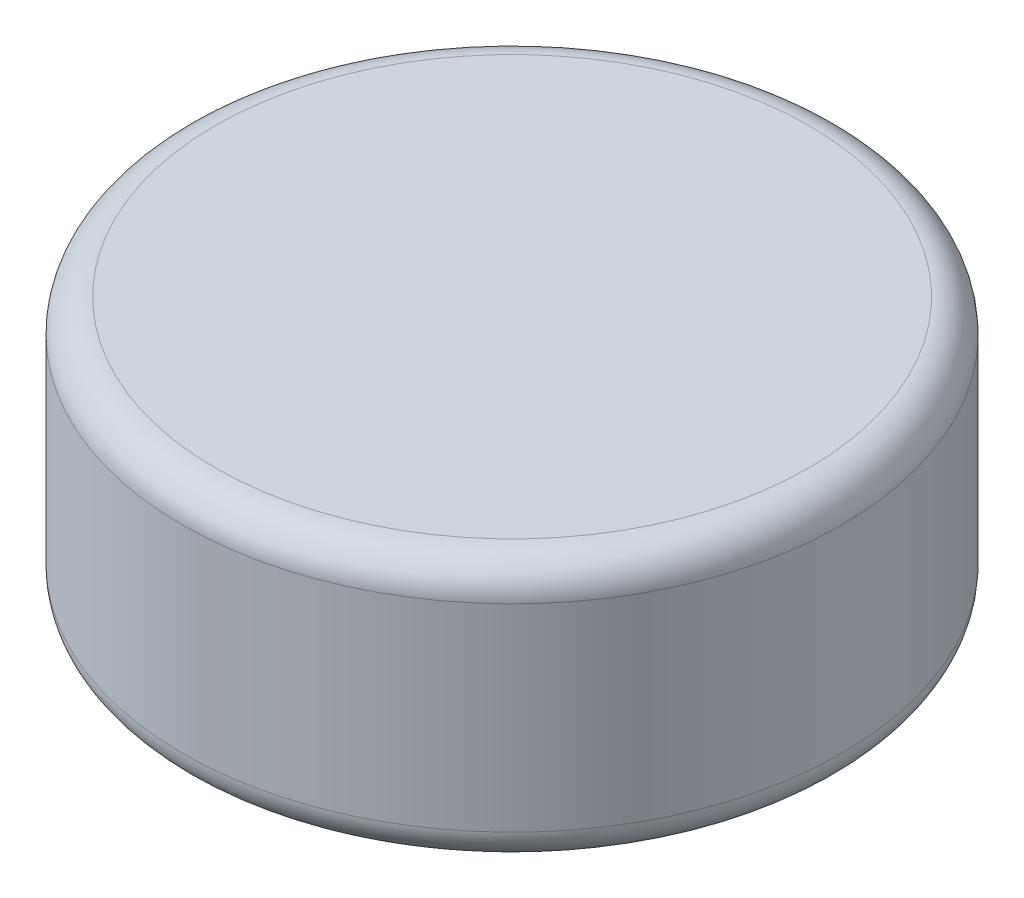
ISO-10303-21;
HEADER;
FILE_DESCRIPTION(('STEP AP214'),'2;1');
FILE_NAME('part.step','',(''),(''),'','','');
FILE_SCHEMA(('AUTOMOTIVE_DESIGN { 1 0 10303 214 1 1 1 1 }'));
ENDSEC;
DATA;
#1=APPLICATION_CONTEXT('core data for automotive mechanical design processes');
#2=APPLICATION_PROTOCOL_DEFINITION('international standard','automotive_design',2000,#1);
#3=PRODUCT_CONTEXT('',#1,'mechanical');
#4=PRODUCT('Part','Part','',(#3));
#5=PRODUCT_RELATED_PRODUCT_CATEGORY('part','',(#4));
#6=PRODUCT_DEFINITION_FORMATION('','',#4);
#7=PRODUCT_DEFINITION_CONTEXT('part definition',#1,'design');
#8=PRODUCT_DEFINITION('design','',#6,#7);
#9=PRODUCT_DEFINITION_SHAPE('','',#8);
#10=(LENGTH_UNIT() NAMED_UNIT(*) SI_UNIT(.MILLI.,.METRE.));
#11=(NAMED_UNIT(*) PLANE_ANGLE_UNIT() SI_UNIT($,.RADIAN.));
#12=(NAMED_UNIT(*) SI_UNIT($,.STERADIAN.) SOLID_ANGLE_UNIT());
#13=UNCERTAINTY_MEASURE_WITH_UNIT(LENGTH_MEASURE(1.E-05),#10,'distance_accuracy_value','');
#14=(GEOMETRIC_REPRESENTATION_CONTEXT(3) GLOBAL_UNCERTAINTY_ASSIGNED_CONTEXT((#13)) GLOBAL_UNIT_ASSIGNED_CONTEXT((#10,
#11,#12)) REPRESENTATION_CONTEXT('',''));
#15=CARTESIAN_POINT('',(0.,0.,0.));
#16=DIRECTION('',(0.,0.,1.));
#17=DIRECTION('',(1.,0.,0.));
#18=AXIS2_PLACEMENT_3D('',#15,#16,#17);
#19=CARTESIAN_POINT('',(0.,2.,0.));
#20=DIRECTION('',(0.,-1.,0.));
#21=DIRECTION('',(0.,0.,-1.));
#22=AXIS2_PLACEMENT_3D('',#19,#20,#21);
#23=CYLINDRICAL_SURFACE('',#22,2.5);
#24=CARTESIAN_POINT('',(0.,0.25,0.));
#25=DIRECTION('',(0.,1.,0.));
#26=DIRECTION('',(0.,0.,1.));
#27=AXIS2_PLACEMENT_3D('',#24,#25,#26);
#28=CIRCLE('',#27,2.5);
#29=CARTESIAN_POINT('',(0.,0.25,2.5));
#30=VERTEX_POINT('',#29);
#31=EDGE_CURVE('E46',#30,#30,#28,.T.);
#32=ORIENTED_EDGE('',*,*,#31,.T.);
#33=EDGE_LOOP('',(#32));
#34=FACE_BOUND('',#33,.T.);
#35=CARTESIAN_POINT('',(0.,1.75,0.));
#36=DIRECTION('',(0.,1.,0.));
#37=DIRECTION('',(0.,0.,1.));
#38=AXIS2_PLACEMENT_3D('',#35,#36,#37);
#39=CIRCLE('',#38,2.5);
#40=CARTESIAN_POINT('',(0.,1.75,2.5));
#41=VERTEX_POINT('',#40);
#42=EDGE_CURVE('E50',#41,#41,#39,.F.);
#43=ORIENTED_EDGE('',*,*,#42,.T.);
#44=EDGE_LOOP('',(#43));
#45=FACE_BOUND('',#44,.T.);
#46=ADVANCED_FACE('F35',(#34,#45),#23,.T.);
#47=CARTESIAN_POINT('',(0.,2.,0.));
#48=DIRECTION('',(0.,1.,0.));
#49=DIRECTION('',(0.,0.,1.));
#50=AXIS2_PLACEMENT_3D('',#47,#48,#49);
#51=PLANE('',#50);
#52=CARTESIAN_POINT('',(0.,2.,0.));
#53=DIRECTION('',(0.,1.,0.));
#54=DIRECTION('',(0.,0.,1.));
#55=AXIS2_PLACEMENT_3D('',#52,#53,#54);
#56=CIRCLE('',#55,2.25);
#57=CARTESIAN_POINT('',(0.,2.,2.25));
#58=VERTEX_POINT('',#57);
#59=EDGE_CURVE('E10',#58,#58,#56,.T.);
#60=ORIENTED_EDGE('',*,*,#59,.T.);
#61=EDGE_LOOP('',(#60));
#62=FACE_BOUND('',#61,.T.);
#63=ADVANCED_FACE('F66',(#62),#51,.T.);
#64=CARTESIAN_POINT('',(0.,0.,0.));
#65=DIRECTION('',(0.,1.,0.));
#66=DIRECTION('',(0.,0.,1.));
#67=AXIS2_PLACEMENT_3D('',#64,#65,#66);
#68=PLANE('',#67);
#69=CARTESIAN_POINT('',(0.,0.,0.));
#70=DIRECTION('',(0.,1.,0.));
#71=DIRECTION('',(0.,0.,1.));
#72=AXIS2_PLACEMENT_3D('',#69,#70,#71);
#73=CIRCLE('',#72,2.25);
#74=CARTESIAN_POINT('',(0.,0.,2.25));
#75=VERTEX_POINT('',#74);
#76=EDGE_CURVE('E42',#75,#75,#73,.F.);
#77=ORIENTED_EDGE('',*,*,#76,.T.);
#78=EDGE_LOOP('',(#77));
#79=FACE_BOUND('',#78,.T.);
#80=ADVANCED_FACE('F63',(#79),#68,.F.);
#81=CARTESIAN_POINT('',(0.,0.25,0.));
#82=DIRECTION('',(0.,1.,0.));
#83=DIRECTION('',(0.,0.,1.));
#84=AXIS2_PLACEMENT_3D('',#81,#82,#83);
#85=TOROIDAL_SURFACE('',#84,2.25,0.25);
#86=ORIENTED_EDGE('',*,*,#76,.F.);
#87=EDGE_LOOP('',(#86));
#88=FACE_BOUND('',#87,.T.);
#89=ORIENTED_EDGE('',*,*,#31,.F.);
#90=EDGE_LOOP('',(#89));
#91=FACE_BOUND('',#90,.T.);
#92=ADVANCED_FACE('F59',(#88,#91),#85,.T.);
#93=CARTESIAN_POINT('',(0.,1.75,0.));
#94=DIRECTION('',(0.,1.,0.));
#95=DIRECTION('',(0.,0.,1.));
#96=AXIS2_PLACEMENT_3D('',#93,#94,#95);
#97=TOROIDAL_SURFACE('',#96,2.25,0.25);
#98=ORIENTED_EDGE('',*,*,#42,.F.);
#99=EDGE_LOOP('',(#98));
#100=FACE_BOUND('',#99,.T.);
#101=ORIENTED_EDGE('',*,*,#59,.F.);
#102=EDGE_LOOP('',(#101));
#103=FACE_BOUND('',#102,.T.);
#104=ADVANCED_FACE('F37',(#100,#103),#97,.T.);
#105=CLOSED_SHELL('',(#46,#63,#80,#92,#104));
#106=MANIFOLD_SOLID_BREP('B2',#105);
#107=ADVANCED_BREP_SHAPE_REPRESENTATION('',(#18,#106),#14);
#108=SHAPE_DEFINITION_REPRESENTATION(#9,#107);
ENDSEC;
END-ISO-10303-21;
